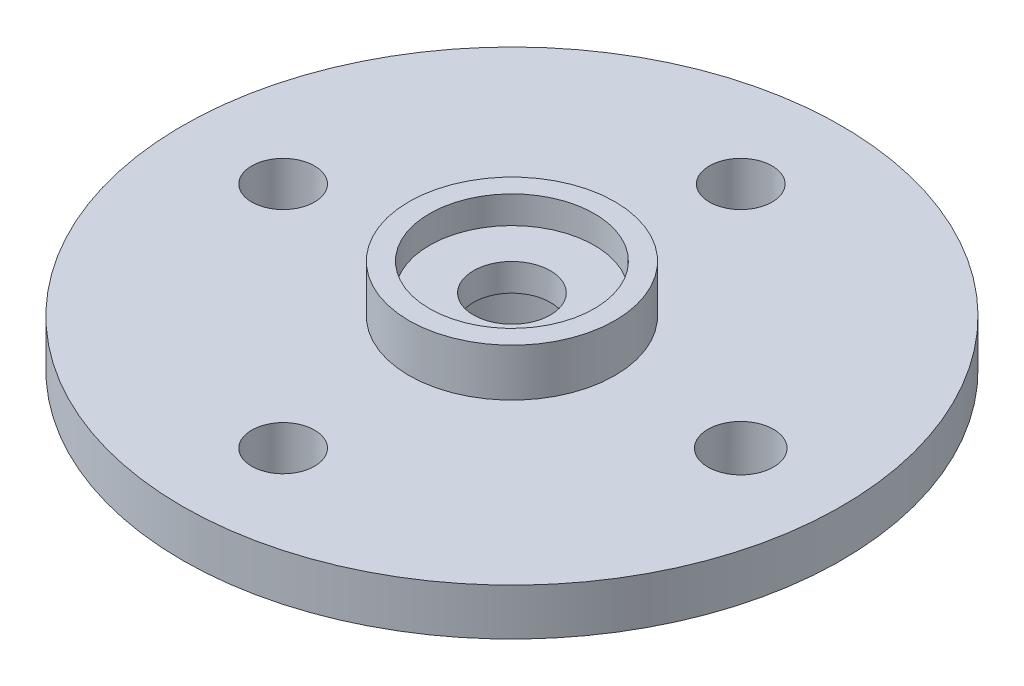
ISO-10303-21;
HEADER;
FILE_DESCRIPTION(('STEP AP214'),'2;1');
FILE_NAME('part.step','',(''),(''),'','','');
FILE_SCHEMA(('AUTOMOTIVE_DESIGN { 1 0 10303 214 1 1 1 1 }'));
ENDSEC;
DATA;
#1=APPLICATION_CONTEXT('core data for automotive mechanical design processes');
#2=APPLICATION_PROTOCOL_DEFINITION('international standard','automotive_design',2000,#1);
#3=PRODUCT_CONTEXT('',#1,'mechanical');
#4=PRODUCT('Part','Part','',(#3));
#5=PRODUCT_RELATED_PRODUCT_CATEGORY('part','',(#4));
#6=PRODUCT_DEFINITION_FORMATION('','',#4);
#7=PRODUCT_DEFINITION_CONTEXT('part definition',#1,'design');
#8=PRODUCT_DEFINITION('design','',#6,#7);
#9=PRODUCT_DEFINITION_SHAPE('','',#8);
#10=(LENGTH_UNIT() NAMED_UNIT(*) SI_UNIT(.MILLI.,.METRE.));
#11=(NAMED_UNIT(*) PLANE_ANGLE_UNIT() SI_UNIT($,.RADIAN.));
#12=(NAMED_UNIT(*) SI_UNIT($,.STERADIAN.) SOLID_ANGLE_UNIT());
#13=UNCERTAINTY_MEASURE_WITH_UNIT(LENGTH_MEASURE(1.E-05),#10,'distance_accuracy_value','');
#14=(GEOMETRIC_REPRESENTATION_CONTEXT(3) GLOBAL_UNCERTAINTY_ASSIGNED_CONTEXT((#13)) GLOBAL_UNIT_ASSIGNED_CONTEXT((#10,
#11,#12)) REPRESENTATION_CONTEXT('',''));
#15=CARTESIAN_POINT('',(0.,0.,0.));
#16=DIRECTION('',(0.,0.,1.));
#17=DIRECTION('',(1.,0.,0.));
#18=AXIS2_PLACEMENT_3D('',#15,#16,#17);
#19=CARTESIAN_POINT('',(0.,0.,0.));
#20=DIRECTION('',(0.,1.,0.));
#21=DIRECTION('',(0.,0.,1.));
#22=AXIS2_PLACEMENT_3D('',#19,#20,#21);
#23=CYLINDRICAL_SURFACE('',#22,1.4);
#24=CARTESIAN_POINT('',(0.,0.732400048,0.));
#25=DIRECTION('',(0.,1.,0.));
#26=DIRECTION('',(0.,0.,1.));
#27=AXIS2_PLACEMENT_3D('',#24,#25,#26);
#28=CIRCLE('',#27,1.4);
#29=CARTESIAN_POINT('',(0.,0.732400048,1.4));
#30=VERTEX_POINT('',#29);
#31=EDGE_CURVE('E51',#30,#30,#28,.T.);
#32=ORIENTED_EDGE('',*,*,#31,.T.);
#33=EDGE_LOOP('',(#32));
#34=FACE_BOUND('',#33,.T.);
#35=CARTESIAN_POINT('',(0.,-0.267599952,0.));
#36=DIRECTION('',(0.,-1.,0.));
#37=DIRECTION('',(0.,0.,-1.));
#38=AXIS2_PLACEMENT_3D('',#35,#36,#37);
#39=CIRCLE('',#38,1.4);
#40=CARTESIAN_POINT('',(0.,-0.267599952,-1.4));
#41=VERTEX_POINT('',#40);
#42=EDGE_CURVE('E39',#41,#41,#39,.T.);
#43=ORIENTED_EDGE('',*,*,#42,.T.);
#44=EDGE_LOOP('',(#43));
#45=FACE_BOUND('',#44,.T.);
#46=ADVANCED_FACE('F35',(#34,#45),#23,.F.);
#47=CARTESIAN_POINT('',(0.,0.,0.));
#48=DIRECTION('',(0.,1.,0.));
#49=DIRECTION('',(0.,0.,1.));
#50=AXIS2_PLACEMENT_3D('',#47,#48,#49);
#51=CYLINDRICAL_SURFACE('',#50,12.);
#52=CARTESIAN_POINT('',(0.,-1.700599952,0.));
#53=DIRECTION('',(0.,1.,0.));
#54=DIRECTION('',(0.,0.,1.));
#55=AXIS2_PLACEMENT_3D('',#52,#53,#54);
#56=CIRCLE('',#55,12.);
#57=CARTESIAN_POINT('',(0.,-1.700599952,12.));
#58=VERTEX_POINT('',#57);
#59=EDGE_CURVE('E10',#58,#58,#56,.T.);
#60=ORIENTED_EDGE('',*,*,#59,.T.);
#61=EDGE_LOOP('',(#60));
#62=FACE_BOUND('',#61,.T.);
#63=CARTESIAN_POINT('',(0.,0.,0.));
#64=DIRECTION('',(0.,1.,0.));
#65=DIRECTION('',(0.,0.,1.));
#66=AXIS2_PLACEMENT_3D('',#63,#64,#65);
#67=CIRCLE('',#66,12.);
#68=CARTESIAN_POINT('',(0.,0.,12.));
#69=VERTEX_POINT('',#68);
#70=EDGE_CURVE('E53',#69,#69,#67,.T.);
#71=ORIENTED_EDGE('',*,*,#70,.F.);
#72=EDGE_LOOP('',(#71));
#73=FACE_BOUND('',#72,.T.);
#74=ADVANCED_FACE('F37',(#62,#73),#51,.T.);
#75=CARTESIAN_POINT('',(-12.,-1.700599952,0.));
#76=DIRECTION('',(0.,-1.,0.));
#77=DIRECTION('',(0.,0.,-1.));
#78=AXIS2_PLACEMENT_3D('',#75,#76,#77);
#79=PLANE('',#78);
#80=CARTESIAN_POINT('',(8.3312,-1.700599952,0.));
#81=DIRECTION('',(0.,-1.,0.));
#82=DIRECTION('',(0.,0.,-1.));
#83=AXIS2_PLACEMENT_3D('',#80,#81,#82);
#84=CIRCLE('',#83,1.1938);
#85=CARTESIAN_POINT('',(8.3312,-1.700599952,-1.1938));
#86=VERTEX_POINT('',#85);
#87=EDGE_CURVE('E146',#86,#86,#84,.F.);
#88=ORIENTED_EDGE('',*,*,#87,.T.);
#89=EDGE_LOOP('',(#88));
#90=FACE_BOUND('',#89,.T.);
#91=CARTESIAN_POINT('',(0.,-1.700599952,8.3312));
#92=DIRECTION('',(0.,-1.,0.));
#93=DIRECTION('',(0.,0.,-1.));
#94=AXIS2_PLACEMENT_3D('',#91,#92,#93);
#95=CIRCLE('',#94,1.143);
#96=CARTESIAN_POINT('',(0.,-1.700599952,7.1882));
#97=VERTEX_POINT('',#96);
#98=EDGE_CURVE('E150',#97,#97,#95,.F.);
#99=ORIENTED_EDGE('',*,*,#98,.T.);
#100=EDGE_LOOP('',(#99));
#101=FACE_BOUND('',#100,.T.);
#102=CARTESIAN_POINT('',(-8.3312,-1.700599952,0.));
#103=DIRECTION('',(0.,-1.,0.));
#104=DIRECTION('',(0.,0.,-1.));
#105=AXIS2_PLACEMENT_3D('',#102,#103,#104);
#106=CIRCLE('',#105,1.143);
#107=CARTESIAN_POINT('',(-8.3312,-1.700599952,-1.143));
#108=VERTEX_POINT('',#107);
#109=EDGE_CURVE('E158',#108,#108,#106,.F.);
#110=ORIENTED_EDGE('',*,*,#109,.T.);
#111=EDGE_LOOP('',(#110));
#112=FACE_BOUND('',#111,.T.);
#113=CARTESIAN_POINT('',(0.,-1.700599952,-8.3312));
#114=DIRECTION('',(0.,-1.,0.));
#115=DIRECTION('',(0.,0.,-1.));
#116=AXIS2_PLACEMENT_3D('',#113,#114,#115);
#117=CIRCLE('',#116,1.143);
#118=CARTESIAN_POINT('',(0.,-1.700599952,-9.4742));
#119=VERTEX_POINT('',#118);
#120=EDGE_CURVE('E163',#119,#119,#117,.F.);
#121=ORIENTED_EDGE('',*,*,#120,.T.);
#122=EDGE_LOOP('',(#121));
#123=FACE_BOUND('',#122,.T.);
#124=CARTESIAN_POINT('',(0.,-1.700599952,0.));
#125=DIRECTION('',(0.,1.,0.));
#126=DIRECTION('',(0.,0.,1.));
#127=AXIS2_PLACEMENT_3D('',#124,#125,#126);
#128=CIRCLE('',#127,4.45);
#129=CARTESIAN_POINT('',(0.,-1.700599952,4.45));
#130=VERTEX_POINT('',#129);
#131=EDGE_CURVE('E43',#130,#130,#128,.T.);
#132=ORIENTED_EDGE('',*,*,#131,.T.);
#133=EDGE_LOOP('',(#132));
#134=FACE_BOUND('',#133,.T.);
#135=ORIENTED_EDGE('',*,*,#59,.F.);
#136=EDGE_LOOP('',(#135));
#137=FACE_BOUND('',#136,.T.);
#138=ADVANCED_FACE('F93',(#90,#101,#112,#123,#134,#137),#79,.T.);
#139=CARTESIAN_POINT('',(0.,0.,0.));
#140=DIRECTION('',(0.,1.,0.));
#141=DIRECTION('',(0.,0.,1.));
#142=AXIS2_PLACEMENT_3D('',#139,#140,#141);
#143=CYLINDRICAL_SURFACE('',#142,4.45);
#144=CARTESIAN_POINT('',(0.,-3.267599952,0.));
#145=DIRECTION('',(0.,1.,0.));
#146=DIRECTION('',(0.,0.,1.));
#147=AXIS2_PLACEMENT_3D('',#144,#145,#146);
#148=CIRCLE('',#147,4.45);
#149=CARTESIAN_POINT('',(0.,-3.267599952,4.45));
#150=VERTEX_POINT('',#149);
#151=EDGE_CURVE('E48',#150,#150,#148,.T.);
#152=ORIENTED_EDGE('',*,*,#151,.T.);
#153=EDGE_LOOP('',(#152));
#154=FACE_BOUND('',#153,.T.);
#155=ORIENTED_EDGE('',*,*,#131,.F.);
#156=EDGE_LOOP('',(#155));
#157=FACE_BOUND('',#156,.T.);
#158=ADVANCED_FACE('F78',(#154,#157),#143,.T.);
#159=CARTESIAN_POINT('',(-4.45,-3.267599952,0.));
#160=DIRECTION('',(0.,-1.,0.));
#161=DIRECTION('',(0.,0.,-1.));
#162=AXIS2_PLACEMENT_3D('',#159,#160,#161);
#163=PLANE('',#162);
#164=CARTESIAN_POINT('',(0.,-3.267599952,0.));
#165=DIRECTION('',(0.,-1.,0.));
#166=DIRECTION('',(0.,0.,-1.));
#167=AXIS2_PLACEMENT_3D('',#164,#165,#166);
#168=CIRCLE('',#167,3.);
#169=CARTESIAN_POINT('',(0.,-3.267599952,-3.));
#170=VERTEX_POINT('',#169);
#171=EDGE_CURVE('E68',#170,#170,#168,.T.);
#172=ORIENTED_EDGE('',*,*,#171,.F.);
#173=EDGE_LOOP('',(#172));
#174=FACE_BOUND('',#173,.T.);
#175=ORIENTED_EDGE('',*,*,#151,.F.);
#176=EDGE_LOOP('',(#175));
#177=FACE_BOUND('',#176,.T.);
#178=ADVANCED_FACE('F81',(#174,#177),#163,.T.);
#179=CARTESIAN_POINT('',(-3.75,1.732400048,0.));
#180=DIRECTION('',(0.,1.,0.));
#181=DIRECTION('',(0.,0.,1.));
#182=AXIS2_PLACEMENT_3D('',#179,#180,#181);
#183=PLANE('',#182);
#184=CARTESIAN_POINT('',(0.,1.732400048,0.));
#185=DIRECTION('',(0.,1.,0.));
#186=DIRECTION('',(0.,0.,1.));
#187=AXIS2_PLACEMENT_3D('',#184,#185,#186);
#188=CIRCLE('',#187,3.);
#189=CARTESIAN_POINT('',(0.,1.732400048,3.));
#190=VERTEX_POINT('',#189);
#191=EDGE_CURVE('E61',#190,#190,#188,.T.);
#192=ORIENTED_EDGE('',*,*,#191,.F.);
#193=EDGE_LOOP('',(#192));
#194=FACE_BOUND('',#193,.T.);
#195=CARTESIAN_POINT('',(0.,1.732400048,0.));
#196=DIRECTION('',(0.,1.,0.));
#197=DIRECTION('',(0.,0.,1.));
#198=AXIS2_PLACEMENT_3D('',#195,#196,#197);
#199=CIRCLE('',#198,3.75);
#200=CARTESIAN_POINT('',(0.,1.732400048,3.75));
#201=VERTEX_POINT('',#200);
#202=EDGE_CURVE('E73',#201,#201,#199,.T.);
#203=ORIENTED_EDGE('',*,*,#202,.T.);
#204=EDGE_LOOP('',(#203));
#205=FACE_BOUND('',#204,.T.);
#206=ADVANCED_FACE('F83',(#194,#205),#183,.T.);
#207=CARTESIAN_POINT('',(0.,0.,0.));
#208=DIRECTION('',(0.,1.,0.));
#209=DIRECTION('',(0.,0.,1.));
#210=AXIS2_PLACEMENT_3D('',#207,#208,#209);
#211=CYLINDRICAL_SURFACE('',#210,3.75);
#212=CARTESIAN_POINT('',(0.,0.,0.));
#213=DIRECTION('',(0.,1.,0.));
#214=DIRECTION('',(0.,0.,1.));
#215=AXIS2_PLACEMENT_3D('',#212,#213,#214);
#216=CIRCLE('',#215,3.75);
#217=CARTESIAN_POINT('',(0.,0.,3.75));
#218=VERTEX_POINT('',#217);
#219=EDGE_CURVE('E58',#218,#218,#216,.T.);
#220=ORIENTED_EDGE('',*,*,#219,.T.);
#221=EDGE_LOOP('',(#220));
#222=FACE_BOUND('',#221,.T.);
#223=ORIENTED_EDGE('',*,*,#202,.F.);
#224=EDGE_LOOP('',(#223));
#225=FACE_BOUND('',#224,.T.);
#226=ADVANCED_FACE('F90',(#222,#225),#211,.T.);
#227=CARTESIAN_POINT('',(-12.,0.,0.));
#228=DIRECTION('',(0.,1.,0.));
#229=DIRECTION('',(0.,0.,1.));
#230=AXIS2_PLACEMENT_3D('',#227,#228,#229);
#231=PLANE('',#230);
#232=CARTESIAN_POINT('',(8.3312,0.,0.));
#233=DIRECTION('',(0.,1.,0.));
#234=DIRECTION('',(0.,0.,1.));
#235=AXIS2_PLACEMENT_3D('',#232,#233,#234);
#236=CIRCLE('',#235,1.1938);
#237=CARTESIAN_POINT('',(8.3312,0.,1.1938));
#238=VERTEX_POINT('',#237);
#239=EDGE_CURVE('E149',#238,#238,#236,.T.);
#240=ORIENTED_EDGE('',*,*,#239,.F.);
#241=EDGE_LOOP('',(#240));
#242=FACE_BOUND('',#241,.T.);
#243=CARTESIAN_POINT('',(0.,0.,8.3312));
#244=DIRECTION('',(0.,1.,0.));
#245=DIRECTION('',(0.,0.,1.));
#246=AXIS2_PLACEMENT_3D('',#243,#244,#245);
#247=CIRCLE('',#246,1.143);
#248=CARTESIAN_POINT('',(0.,0.,9.4742));
#249=VERTEX_POINT('',#248);
#250=EDGE_CURVE('E153',#249,#249,#247,.T.);
#251=ORIENTED_EDGE('',*,*,#250,.F.);
#252=EDGE_LOOP('',(#251));
#253=FACE_BOUND('',#252,.T.);
#254=CARTESIAN_POINT('',(-8.3312,0.,0.));
#255=DIRECTION('',(0.,1.,0.));
#256=DIRECTION('',(0.,0.,1.));
#257=AXIS2_PLACEMENT_3D('',#254,#255,#256);
#258=CIRCLE('',#257,1.143);
#259=CARTESIAN_POINT('',(-8.3312,0.,1.143));
#260=VERTEX_POINT('',#259);
#261=EDGE_CURVE('E160',#260,#260,#258,.T.);
#262=ORIENTED_EDGE('',*,*,#261,.F.);
#263=EDGE_LOOP('',(#262));
#264=FACE_BOUND('',#263,.T.);
#265=CARTESIAN_POINT('',(0.,0.,-8.3312));
#266=DIRECTION('',(0.,1.,0.));
#267=DIRECTION('',(0.,0.,1.));
#268=AXIS2_PLACEMENT_3D('',#265,#266,#267);
#269=CIRCLE('',#268,1.143);
#270=CARTESIAN_POINT('',(0.,0.,-7.1882));
#271=VERTEX_POINT('',#270);
#272=EDGE_CURVE('E166',#271,#271,#269,.T.);
#273=ORIENTED_EDGE('',*,*,#272,.F.);
#274=EDGE_LOOP('',(#273));
#275=FACE_BOUND('',#274,.T.);
#276=ORIENTED_EDGE('',*,*,#70,.T.);
#277=EDGE_LOOP('',(#276));
#278=FACE_BOUND('',#277,.T.);
#279=ORIENTED_EDGE('',*,*,#219,.F.);
#280=EDGE_LOOP('',(#279));
#281=FACE_BOUND('',#280,.T.);
#282=ADVANCED_FACE('F105',(#242,#253,#264,#275,#278,#281),#231,.T.);
#283=CARTESIAN_POINT('',(0.,0.732400048,0.));
#284=DIRECTION('',(0.,1.,0.));
#285=DIRECTION('',(0.,0.,1.));
#286=AXIS2_PLACEMENT_3D('',#283,#284,#285);
#287=CYLINDRICAL_SURFACE('',#286,3.);
#288=CARTESIAN_POINT('',(0.,0.732400048,0.));
#289=DIRECTION('',(0.,1.,0.));
#290=DIRECTION('',(0.,0.,1.));
#291=AXIS2_PLACEMENT_3D('',#288,#289,#290);
#292=CIRCLE('',#291,3.);
#293=CARTESIAN_POINT('',(0.,0.732400048,3.));
#294=VERTEX_POINT('',#293);
#295=EDGE_CURVE('E54',#294,#294,#292,.T.);
#296=ORIENTED_EDGE('',*,*,#295,.F.);
#297=EDGE_LOOP('',(#296));
#298=FACE_BOUND('',#297,.T.);
#299=ORIENTED_EDGE('',*,*,#191,.T.);
#300=EDGE_LOOP('',(#299));
#301=FACE_BOUND('',#300,.T.);
#302=ADVANCED_FACE('F109',(#298,#301),#287,.F.);
#303=CARTESIAN_POINT('',(0.,0.732400048,0.));
#304=DIRECTION('',(0.,1.,0.));
#305=DIRECTION('',(0.,0.,1.));
#306=AXIS2_PLACEMENT_3D('',#303,#304,#305);
#307=PLANE('',#306);
#308=ORIENTED_EDGE('',*,*,#31,.F.);
#309=EDGE_LOOP('',(#308));
#310=FACE_BOUND('',#309,.T.);
#311=ORIENTED_EDGE('',*,*,#295,.T.);
#312=EDGE_LOOP('',(#311));
#313=FACE_BOUND('',#312,.T.);
#314=ADVANCED_FACE('F113',(#310,#313),#307,.T.);
#315=CARTESIAN_POINT('',(0.,-0.267599952,0.));
#316=DIRECTION('',(0.,-1.,0.));
#317=DIRECTION('',(0.,0.,-1.));
#318=AXIS2_PLACEMENT_3D('',#315,#316,#317);
#319=CYLINDRICAL_SURFACE('',#318,3.);
#320=CARTESIAN_POINT('',(0.,-0.267599952,0.));
#321=DIRECTION('',(0.,-1.,0.));
#322=DIRECTION('',(0.,0.,-1.));
#323=AXIS2_PLACEMENT_3D('',#320,#321,#322);
#324=CIRCLE('',#323,3.);
#325=CARTESIAN_POINT('',(0.,-0.267599952,-3.));
#326=VERTEX_POINT('',#325);
#327=EDGE_CURVE('E170',#326,#326,#324,.T.);
#328=ORIENTED_EDGE('',*,*,#327,.F.);
#329=EDGE_LOOP('',(#328));
#330=FACE_BOUND('',#329,.T.);
#331=ORIENTED_EDGE('',*,*,#171,.T.);
#332=EDGE_LOOP('',(#331));
#333=FACE_BOUND('',#332,.T.);
#334=ADVANCED_FACE('F117',(#330,#333),#319,.F.);
#335=CARTESIAN_POINT('',(0.,-0.267599952,0.));
#336=DIRECTION('',(0.,-1.,0.));
#337=DIRECTION('',(0.,0.,-1.));
#338=AXIS2_PLACEMENT_3D('',#335,#336,#337);
#339=PLANE('',#338);
#340=ORIENTED_EDGE('',*,*,#42,.F.);
#341=EDGE_LOOP('',(#340));
#342=FACE_BOUND('',#341,.T.);
#343=ORIENTED_EDGE('',*,*,#327,.T.);
#344=EDGE_LOOP('',(#343));
#345=FACE_BOUND('',#344,.T.);
#346=ADVANCED_FACE('F121',(#342,#345),#339,.T.);
#347=CARTESIAN_POINT('',(0.,-3.268599952,-8.3312));
#348=DIRECTION('',(0.,1.,0.));
#349=DIRECTION('',(0.,0.,1.));
#350=AXIS2_PLACEMENT_3D('',#347,#348,#349);
#351=CYLINDRICAL_SURFACE('',#350,1.143);
#352=ORIENTED_EDGE('',*,*,#120,.F.);
#353=EDGE_LOOP('',(#352));
#354=FACE_BOUND('',#353,.T.);
#355=ORIENTED_EDGE('',*,*,#272,.T.);
#356=EDGE_LOOP('',(#355));
#357=FACE_BOUND('',#356,.T.);
#358=ADVANCED_FACE('F125',(#354,#357),#351,.F.);
#359=CARTESIAN_POINT('',(-8.3312,-3.268599952,0.));
#360=DIRECTION('',(0.,1.,0.));
#361=DIRECTION('',(0.,0.,1.));
#362=AXIS2_PLACEMENT_3D('',#359,#360,#361);
#363=CYLINDRICAL_SURFACE('',#362,1.143);
#364=ORIENTED_EDGE('',*,*,#109,.F.);
#365=EDGE_LOOP('',(#364));
#366=FACE_BOUND('',#365,.T.);
#367=ORIENTED_EDGE('',*,*,#261,.T.);
#368=EDGE_LOOP('',(#367));
#369=FACE_BOUND('',#368,.T.);
#370=ADVANCED_FACE('F129',(#366,#369),#363,.F.);
#371=CARTESIAN_POINT('',(0.,-3.268599952,8.3312));
#372=DIRECTION('',(0.,1.,0.));
#373=DIRECTION('',(0.,0.,1.));
#374=AXIS2_PLACEMENT_3D('',#371,#372,#373);
#375=CYLINDRICAL_SURFACE('',#374,1.143);
#376=ORIENTED_EDGE('',*,*,#98,.F.);
#377=EDGE_LOOP('',(#376));
#378=FACE_BOUND('',#377,.T.);
#379=ORIENTED_EDGE('',*,*,#250,.T.);
#380=EDGE_LOOP('',(#379));
#381=FACE_BOUND('',#380,.T.);
#382=ADVANCED_FACE('F133',(#378,#381),#375,.F.);
#383=CARTESIAN_POINT('',(8.3312,-3.268599952,0.));
#384=DIRECTION('',(0.,1.,0.));
#385=DIRECTION('',(0.,0.,1.));
#386=AXIS2_PLACEMENT_3D('',#383,#384,#385);
#387=CYLINDRICAL_SURFACE('',#386,1.1938);
#388=ORIENTED_EDGE('',*,*,#87,.F.);
#389=EDGE_LOOP('',(#388));
#390=FACE_BOUND('',#389,.T.);
#391=ORIENTED_EDGE('',*,*,#239,.T.);
#392=EDGE_LOOP('',(#391));
#393=FACE_BOUND('',#392,.T.);
#394=ADVANCED_FACE('F137',(#390,#393),#387,.F.);
#395=CLOSED_SHELL('',(#46,#74,#138,#158,#178,#206,#226,#282,#302,#314,#334,#346,#358,#370,#382,#394));
#396=MANIFOLD_SOLID_BREP('B2',#395);
#397=ADVANCED_BREP_SHAPE_REPRESENTATION('',(#18,#396),#14);
#398=SHAPE_DEFINITION_REPRESENTATION(#9,#397);
ENDSEC;
END-ISO-10303-21;
